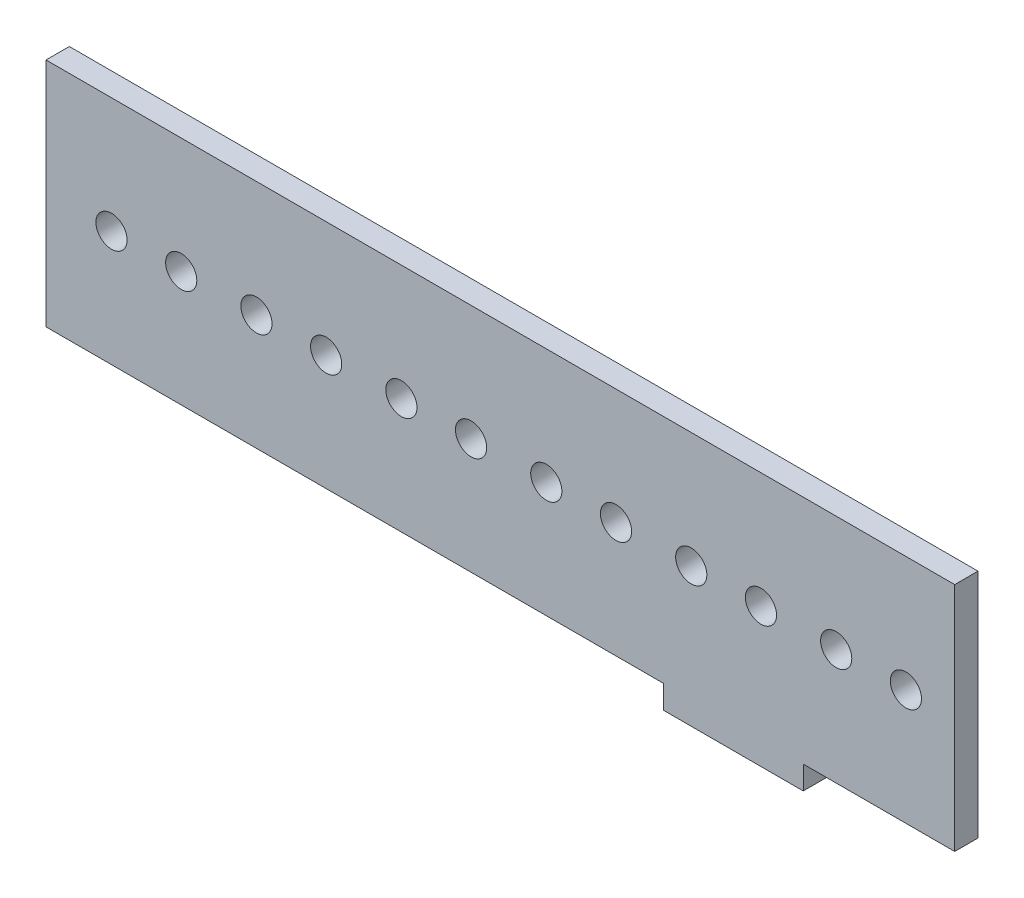
ISO-10303-21;
HEADER;
FILE_DESCRIPTION(('STEP AP214'),'2;1');
FILE_NAME('part.step','',(''),(''),'','','');
FILE_SCHEMA(('AUTOMOTIVE_DESIGN { 1 0 10303 214 1 1 1 1 }'));
ENDSEC;
DATA;
#1=APPLICATION_CONTEXT('core data for automotive mechanical design processes');
#2=APPLICATION_PROTOCOL_DEFINITION('international standard','automotive_design',2000,#1);
#3=PRODUCT_CONTEXT('',#1,'mechanical');
#4=PRODUCT('Part','Part','',(#3));
#5=PRODUCT_RELATED_PRODUCT_CATEGORY('part','',(#4));
#6=PRODUCT_DEFINITION_FORMATION('','',#4);
#7=PRODUCT_DEFINITION_CONTEXT('part definition',#1,'design');
#8=PRODUCT_DEFINITION('design','',#6,#7);
#9=PRODUCT_DEFINITION_SHAPE('','',#8);
#10=(LENGTH_UNIT() NAMED_UNIT(*) SI_UNIT(.MILLI.,.METRE.));
#11=(NAMED_UNIT(*) PLANE_ANGLE_UNIT() SI_UNIT($,.RADIAN.));
#12=(NAMED_UNIT(*) SI_UNIT($,.STERADIAN.) SOLID_ANGLE_UNIT());
#13=UNCERTAINTY_MEASURE_WITH_UNIT(LENGTH_MEASURE(1.E-05),#10,'distance_accuracy_value','');
#14=(GEOMETRIC_REPRESENTATION_CONTEXT(3) GLOBAL_UNCERTAINTY_ASSIGNED_CONTEXT((#13)) GLOBAL_UNIT_ASSIGNED_CONTEXT((#10,
#11,#12)) REPRESENTATION_CONTEXT('',''));
#15=CARTESIAN_POINT('',(0.,0.,0.));
#16=DIRECTION('',(0.,0.,1.));
#17=DIRECTION('',(1.,0.,0.));
#18=AXIS2_PLACEMENT_3D('',#15,#16,#17);
#19=CARTESIAN_POINT('',(0.,0.,6.35));
#20=DIRECTION('',(0.,0.,-1.));
#21=DIRECTION('',(-1.,0.,0.));
#22=AXIS2_PLACEMENT_3D('',#19,#20,#21);
#23=PLANE('',#22);
#24=DIRECTION('',(-1.,0.,0.));
#25=VECTOR('',#24,1.);
#26=CARTESIAN_POINT('',(-123.825,31.5,6.35));
#27=LINE('',#26,#25);
#28=CARTESIAN_POINT('',(123.825,31.5,6.35));
#29=VERTEX_POINT('',#28);
#30=CARTESIAN_POINT('',(-123.825,31.5,6.35));
#31=VERTEX_POINT('',#30);
#32=EDGE_CURVE('E164',#29,#31,#27,.T.);
#33=ORIENTED_EDGE('',*,*,#32,.T.);
#34=DIRECTION('',(0.,-1.,0.));
#35=VECTOR('',#34,1.);
#36=CARTESIAN_POINT('',(-123.825,-31.5,6.35));
#37=LINE('',#36,#35);
#38=CARTESIAN_POINT('',(-123.825,-31.5,6.35));
#39=VERTEX_POINT('',#38);
#40=EDGE_CURVE('E100',#31,#39,#37,.T.);
#41=ORIENTED_EDGE('',*,*,#40,.T.);
#42=DIRECTION('',(1.,0.,0.));
#43=VECTOR('',#42,1.);
#44=CARTESIAN_POINT('',(44.45,-31.5,6.35));
#45=LINE('',#44,#43);
#46=CARTESIAN_POINT('',(44.45,-31.5,6.35));
#47=VERTEX_POINT('',#46);
#48=EDGE_CURVE('E185',#39,#47,#45,.T.);
#49=ORIENTED_EDGE('',*,*,#48,.T.);
#50=DIRECTION('',(0.,-1.,0.));
#51=VECTOR('',#50,1.);
#52=CARTESIAN_POINT('',(44.45,-31.5,6.35));
#53=LINE('',#52,#51);
#54=CARTESIAN_POINT('',(44.45,-37.85,6.35));
#55=VERTEX_POINT('',#54);
#56=EDGE_CURVE('E199',#47,#55,#53,.T.);
#57=ORIENTED_EDGE('',*,*,#56,.T.);
#58=DIRECTION('',(1.,0.,0.));
#59=VECTOR('',#58,1.);
#60=CARTESIAN_POINT('',(44.45,-37.85,6.35));
#61=LINE('',#60,#59);
#62=CARTESIAN_POINT('',(82.55,-37.85,6.35));
#63=VERTEX_POINT('',#62);
#64=EDGE_CURVE('E119',#55,#63,#61,.T.);
#65=ORIENTED_EDGE('',*,*,#64,.T.);
#66=DIRECTION('',(0.,1.,0.));
#67=VECTOR('',#66,1.);
#68=CARTESIAN_POINT('',(82.55,-37.85,6.35));
#69=LINE('',#68,#67);
#70=CARTESIAN_POINT('',(82.55,-31.5,6.35));
#71=VERTEX_POINT('',#70);
#72=EDGE_CURVE('E113',#63,#71,#69,.T.);
#73=ORIENTED_EDGE('',*,*,#72,.T.);
#74=DIRECTION('',(1.,0.,0.));
#75=VECTOR('',#74,1.);
#76=CARTESIAN_POINT('',(123.825,-31.5,6.35));
#77=LINE('',#76,#75);
#78=CARTESIAN_POINT('',(123.825,-31.5,6.35));
#79=VERTEX_POINT('',#78);
#80=EDGE_CURVE('E117',#71,#79,#77,.T.);
#81=ORIENTED_EDGE('',*,*,#80,.T.);
#82=DIRECTION('',(0.,1.,0.));
#83=VECTOR('',#82,1.);
#84=CARTESIAN_POINT('',(123.825,31.5,6.35));
#85=LINE('',#84,#83);
#86=EDGE_CURVE('E57',#79,#29,#85,.T.);
#87=ORIENTED_EDGE('',*,*,#86,.T.);
#88=EDGE_LOOP('',(#33,#41,#49,#57,#65,#73,#81,#87));
#89=FACE_BOUND('',#88,.T.);
#90=CARTESIAN_POINT('',(-105.975,0.,6.35));
#91=DIRECTION('',(0.,0.,1.));
#92=DIRECTION('',(1.,0.,0.));
#93=AXIS2_PLACEMENT_3D('',#90,#91,#92);
#94=CIRCLE('',#93,4.24999999999998);
#95=CARTESIAN_POINT('',(-101.725,0.,6.35));
#96=VERTEX_POINT('',#95);
#97=EDGE_CURVE('E146',#96,#96,#94,.T.);
#98=ORIENTED_EDGE('',*,*,#97,.F.);
#99=EDGE_LOOP('',(#98));
#100=FACE_BOUND('',#99,.T.);
#101=CARTESIAN_POINT('',(-86.975,0.,6.35));
#102=DIRECTION('',(0.,0.,1.));
#103=DIRECTION('',(1.,0.,0.));
#104=AXIS2_PLACEMENT_3D('',#101,#102,#103);
#105=CIRCLE('',#104,4.25000000000003);
#106=CARTESIAN_POINT('',(-82.725,0.,6.35));
#107=VERTEX_POINT('',#106);
#108=EDGE_CURVE('E213',#107,#107,#105,.T.);
#109=ORIENTED_EDGE('',*,*,#108,.F.);
#110=EDGE_LOOP('',(#109));
#111=FACE_BOUND('',#110,.T.);
#112=CARTESIAN_POINT('',(-66.475,0.,6.35));
#113=DIRECTION('',(0.,0.,1.));
#114=DIRECTION('',(1.,0.,0.));
#115=AXIS2_PLACEMENT_3D('',#112,#113,#114);
#116=CIRCLE('',#115,4.24999999999998);
#117=CARTESIAN_POINT('',(-62.225,0.,6.35));
#118=VERTEX_POINT('',#117);
#119=EDGE_CURVE('E221',#118,#118,#116,.T.);
#120=ORIENTED_EDGE('',*,*,#119,.F.);
#121=EDGE_LOOP('',(#120));
#122=FACE_BOUND('',#121,.T.);
#123=CARTESIAN_POINT('',(-47.475,0.,6.35));
#124=DIRECTION('',(0.,0.,1.));
#125=DIRECTION('',(1.,0.,0.));
#126=AXIS2_PLACEMENT_3D('',#123,#124,#125);
#127=CIRCLE('',#126,4.25000000000001);
#128=CARTESIAN_POINT('',(-43.225,0.,6.35));
#129=VERTEX_POINT('',#128);
#130=EDGE_CURVE('E229',#129,#129,#127,.T.);
#131=ORIENTED_EDGE('',*,*,#130,.F.);
#132=EDGE_LOOP('',(#131));
#133=FACE_BOUND('',#132,.T.);
#134=CARTESIAN_POINT('',(-26.975,0.,6.35));
#135=DIRECTION('',(0.,0.,1.));
#136=DIRECTION('',(1.,0.,0.));
#137=AXIS2_PLACEMENT_3D('',#134,#135,#136);
#138=CIRCLE('',#137,4.25);
#139=CARTESIAN_POINT('',(-22.725,0.,6.35));
#140=VERTEX_POINT('',#139);
#141=EDGE_CURVE('E237',#140,#140,#138,.T.);
#142=ORIENTED_EDGE('',*,*,#141,.F.);
#143=EDGE_LOOP('',(#142));
#144=FACE_BOUND('',#143,.T.);
#145=CARTESIAN_POINT('',(-7.975,0.,6.35));
#146=DIRECTION('',(0.,0.,1.));
#147=DIRECTION('',(1.,0.,0.));
#148=AXIS2_PLACEMENT_3D('',#145,#146,#147);
#149=CIRCLE('',#148,4.25000000000001);
#150=CARTESIAN_POINT('',(-3.72499999999999,0.,6.35));
#151=VERTEX_POINT('',#150);
#152=EDGE_CURVE('E245',#151,#151,#149,.T.);
#153=ORIENTED_EDGE('',*,*,#152,.F.);
#154=EDGE_LOOP('',(#153));
#155=FACE_BOUND('',#154,.T.);
#156=CARTESIAN_POINT('',(12.525,0.,6.35));
#157=DIRECTION('',(0.,0.,1.));
#158=DIRECTION('',(1.,0.,0.));
#159=AXIS2_PLACEMENT_3D('',#156,#157,#158);
#160=CIRCLE('',#159,4.25000000000001);
#161=CARTESIAN_POINT('',(16.775,0.,6.35));
#162=VERTEX_POINT('',#161);
#163=EDGE_CURVE('E253',#162,#162,#160,.T.);
#164=ORIENTED_EDGE('',*,*,#163,.F.);
#165=EDGE_LOOP('',(#164));
#166=FACE_BOUND('',#165,.T.);
#167=CARTESIAN_POINT('',(31.525,0.,6.35));
#168=DIRECTION('',(0.,0.,1.));
#169=DIRECTION('',(1.,0.,0.));
#170=AXIS2_PLACEMENT_3D('',#167,#168,#169);
#171=CIRCLE('',#170,4.25000000000001);
#172=CARTESIAN_POINT('',(35.775,0.,6.35));
#173=VERTEX_POINT('',#172);
#174=EDGE_CURVE('E261',#173,#173,#171,.T.);
#175=ORIENTED_EDGE('',*,*,#174,.F.);
#176=EDGE_LOOP('',(#175));
#177=FACE_BOUND('',#176,.T.);
#178=CARTESIAN_POINT('',(52.025,0.,6.35));
#179=DIRECTION('',(0.,0.,1.));
#180=DIRECTION('',(1.,0.,0.));
#181=AXIS2_PLACEMENT_3D('',#178,#179,#180);
#182=CIRCLE('',#181,4.25000000000001);
#183=CARTESIAN_POINT('',(56.275,0.,6.35));
#184=VERTEX_POINT('',#183);
#185=EDGE_CURVE('E269',#184,#184,#182,.T.);
#186=ORIENTED_EDGE('',*,*,#185,.F.);
#187=EDGE_LOOP('',(#186));
#188=FACE_BOUND('',#187,.T.);
#189=CARTESIAN_POINT('',(71.025,0.,6.35));
#190=DIRECTION('',(0.,0.,1.));
#191=DIRECTION('',(1.,0.,0.));
#192=AXIS2_PLACEMENT_3D('',#189,#190,#191);
#193=CIRCLE('',#192,4.25000000000003);
#194=CARTESIAN_POINT('',(75.275,0.,6.35));
#195=VERTEX_POINT('',#194);
#196=EDGE_CURVE('E277',#195,#195,#193,.T.);
#197=ORIENTED_EDGE('',*,*,#196,.F.);
#198=EDGE_LOOP('',(#197));
#199=FACE_BOUND('',#198,.T.);
#200=CARTESIAN_POINT('',(91.525,0.,6.35));
#201=DIRECTION('',(0.,0.,1.));
#202=DIRECTION('',(1.,0.,0.));
#203=AXIS2_PLACEMENT_3D('',#200,#201,#202);
#204=CIRCLE('',#203,4.25000000000003);
#205=CARTESIAN_POINT('',(95.775,0.,6.35));
#206=VERTEX_POINT('',#205);
#207=EDGE_CURVE('E285',#206,#206,#204,.T.);
#208=ORIENTED_EDGE('',*,*,#207,.F.);
#209=EDGE_LOOP('',(#208));
#210=FACE_BOUND('',#209,.T.);
#211=CARTESIAN_POINT('',(110.525,0.,6.35));
#212=DIRECTION('',(0.,0.,1.));
#213=DIRECTION('',(1.,0.,0.));
#214=AXIS2_PLACEMENT_3D('',#211,#212,#213);
#215=CIRCLE('',#214,4.25000000000003);
#216=CARTESIAN_POINT('',(114.775,0.,6.35));
#217=VERTEX_POINT('',#216);
#218=EDGE_CURVE('E293',#217,#217,#215,.T.);
#219=ORIENTED_EDGE('',*,*,#218,.F.);
#220=EDGE_LOOP('',(#219));
#221=FACE_BOUND('',#220,.T.);
#222=ADVANCED_FACE('F39',(#89,#100,#111,#122,#133,#144,#155,#166,#177,#188,#199,#210,#221),#23,.F.);
#223=CARTESIAN_POINT('',(0.,0.,0.));
#224=DIRECTION('',(0.,0.,-1.));
#225=DIRECTION('',(-1.,0.,0.));
#226=AXIS2_PLACEMENT_3D('',#223,#224,#225);
#227=PLANE('',#226);
#228=CARTESIAN_POINT('',(91.525,0.,0.));
#229=DIRECTION('',(0.,0.,1.));
#230=DIRECTION('',(1.,0.,0.));
#231=AXIS2_PLACEMENT_3D('',#228,#229,#230);
#232=CIRCLE('',#231,4.25000000000003);
#233=CARTESIAN_POINT('',(95.775,0.,0.));
#234=VERTEX_POINT('',#233);
#235=EDGE_CURVE('E289',#234,#234,#232,.T.);
#236=ORIENTED_EDGE('',*,*,#235,.T.);
#237=EDGE_LOOP('',(#236));
#238=FACE_BOUND('',#237,.T.);
#239=CARTESIAN_POINT('',(52.025,0.,0.));
#240=DIRECTION('',(0.,0.,1.));
#241=DIRECTION('',(1.,0.,0.));
#242=AXIS2_PLACEMENT_3D('',#239,#240,#241);
#243=CIRCLE('',#242,4.25000000000001);
#244=CARTESIAN_POINT('',(56.275,0.,0.));
#245=VERTEX_POINT('',#244);
#246=EDGE_CURVE('E273',#245,#245,#243,.T.);
#247=ORIENTED_EDGE('',*,*,#246,.T.);
#248=EDGE_LOOP('',(#247));
#249=FACE_BOUND('',#248,.T.);
#250=CARTESIAN_POINT('',(12.525,0.,0.));
#251=DIRECTION('',(0.,0.,1.));
#252=DIRECTION('',(1.,0.,0.));
#253=AXIS2_PLACEMENT_3D('',#250,#251,#252);
#254=CIRCLE('',#253,4.25000000000001);
#255=CARTESIAN_POINT('',(16.775,0.,0.));
#256=VERTEX_POINT('',#255);
#257=EDGE_CURVE('E257',#256,#256,#254,.T.);
#258=ORIENTED_EDGE('',*,*,#257,.T.);
#259=EDGE_LOOP('',(#258));
#260=FACE_BOUND('',#259,.T.);
#261=CARTESIAN_POINT('',(-26.975,0.,0.));
#262=DIRECTION('',(0.,0.,1.));
#263=DIRECTION('',(1.,0.,0.));
#264=AXIS2_PLACEMENT_3D('',#261,#262,#263);
#265=CIRCLE('',#264,4.25);
#266=CARTESIAN_POINT('',(-22.725,0.,0.));
#267=VERTEX_POINT('',#266);
#268=EDGE_CURVE('E241',#267,#267,#265,.T.);
#269=ORIENTED_EDGE('',*,*,#268,.T.);
#270=EDGE_LOOP('',(#269));
#271=FACE_BOUND('',#270,.T.);
#272=CARTESIAN_POINT('',(-66.475,0.,0.));
#273=DIRECTION('',(0.,0.,1.));
#274=DIRECTION('',(1.,0.,0.));
#275=AXIS2_PLACEMENT_3D('',#272,#273,#274);
#276=CIRCLE('',#275,4.24999999999998);
#277=CARTESIAN_POINT('',(-62.225,0.,0.));
#278=VERTEX_POINT('',#277);
#279=EDGE_CURVE('E225',#278,#278,#276,.T.);
#280=ORIENTED_EDGE('',*,*,#279,.T.);
#281=EDGE_LOOP('',(#280));
#282=FACE_BOUND('',#281,.T.);
#283=CARTESIAN_POINT('',(-105.975,0.,0.));
#284=DIRECTION('',(0.,0.,1.));
#285=DIRECTION('',(1.,0.,0.));
#286=AXIS2_PLACEMENT_3D('',#283,#284,#285);
#287=CIRCLE('',#286,4.24999999999998);
#288=CARTESIAN_POINT('',(-101.725,0.,0.));
#289=VERTEX_POINT('',#288);
#290=EDGE_CURVE('E209',#289,#289,#287,.T.);
#291=ORIENTED_EDGE('',*,*,#290,.T.);
#292=EDGE_LOOP('',(#291));
#293=FACE_BOUND('',#292,.T.);
#294=DIRECTION('',(-1.,0.,0.));
#295=VECTOR('',#294,1.);
#296=CARTESIAN_POINT('',(-123.825,31.5,0.));
#297=LINE('',#296,#295);
#298=CARTESIAN_POINT('',(123.825,31.5,0.));
#299=VERTEX_POINT('',#298);
#300=CARTESIAN_POINT('',(-123.825,31.5,0.));
#301=VERTEX_POINT('',#300);
#302=EDGE_CURVE('E141',#299,#301,#297,.T.);
#303=ORIENTED_EDGE('',*,*,#302,.F.);
#304=DIRECTION('',(0.,1.,0.));
#305=VECTOR('',#304,1.);
#306=CARTESIAN_POINT('',(123.825,31.5,0.));
#307=LINE('',#306,#305);
#308=CARTESIAN_POINT('',(123.825,-31.5,0.));
#309=VERTEX_POINT('',#308);
#310=EDGE_CURVE('E92',#309,#299,#307,.T.);
#311=ORIENTED_EDGE('',*,*,#310,.F.);
#312=DIRECTION('',(1.,0.,0.));
#313=VECTOR('',#312,1.);
#314=CARTESIAN_POINT('',(123.825,-31.5,0.));
#315=LINE('',#314,#313);
#316=CARTESIAN_POINT('',(82.55,-31.5,0.));
#317=VERTEX_POINT('',#316);
#318=EDGE_CURVE('E86',#317,#309,#315,.T.);
#319=ORIENTED_EDGE('',*,*,#318,.F.);
#320=DIRECTION('',(0.,1.,0.));
#321=VECTOR('',#320,1.);
#322=CARTESIAN_POINT('',(82.55,-37.85,0.));
#323=LINE('',#322,#321);
#324=CARTESIAN_POINT('',(82.55,-37.85,0.));
#325=VERTEX_POINT('',#324);
#326=EDGE_CURVE('E128',#325,#317,#323,.T.);
#327=ORIENTED_EDGE('',*,*,#326,.F.);
#328=DIRECTION('',(1.,0.,0.));
#329=VECTOR('',#328,1.);
#330=CARTESIAN_POINT('',(44.45,-37.85,0.));
#331=LINE('',#330,#329);
#332=CARTESIAN_POINT('',(44.45,-37.85,0.));
#333=VERTEX_POINT('',#332);
#334=EDGE_CURVE('E155',#333,#325,#331,.T.);
#335=ORIENTED_EDGE('',*,*,#334,.F.);
#336=DIRECTION('',(0.,-1.,0.));
#337=VECTOR('',#336,1.);
#338=CARTESIAN_POINT('',(44.45,-31.5,0.));
#339=LINE('',#338,#337);
#340=CARTESIAN_POINT('',(44.45,-31.5,0.));
#341=VERTEX_POINT('',#340);
#342=EDGE_CURVE('E152',#341,#333,#339,.T.);
#343=ORIENTED_EDGE('',*,*,#342,.F.);
#344=DIRECTION('',(1.,0.,0.));
#345=VECTOR('',#344,1.);
#346=CARTESIAN_POINT('',(44.45,-31.5,0.));
#347=LINE('',#346,#345);
#348=CARTESIAN_POINT('',(-123.825,-31.5,0.));
#349=VERTEX_POINT('',#348);
#350=EDGE_CURVE('E149',#349,#341,#347,.T.);
#351=ORIENTED_EDGE('',*,*,#350,.F.);
#352=DIRECTION('',(0.,-1.,0.));
#353=VECTOR('',#352,1.);
#354=CARTESIAN_POINT('',(-123.825,-31.5,0.));
#355=LINE('',#354,#353);
#356=EDGE_CURVE('E145',#301,#349,#355,.T.);
#357=ORIENTED_EDGE('',*,*,#356,.F.);
#358=EDGE_LOOP('',(#303,#311,#319,#327,#335,#343,#351,#357));
#359=FACE_BOUND('',#358,.T.);
#360=CARTESIAN_POINT('',(-86.975,0.,0.));
#361=DIRECTION('',(0.,0.,1.));
#362=DIRECTION('',(1.,0.,0.));
#363=AXIS2_PLACEMENT_3D('',#360,#361,#362);
#364=CIRCLE('',#363,4.25000000000003);
#365=CARTESIAN_POINT('',(-82.725,0.,0.));
#366=VERTEX_POINT('',#365);
#367=EDGE_CURVE('E217',#366,#366,#364,.T.);
#368=ORIENTED_EDGE('',*,*,#367,.T.);
#369=EDGE_LOOP('',(#368));
#370=FACE_BOUND('',#369,.T.);
#371=CARTESIAN_POINT('',(-47.475,0.,0.));
#372=DIRECTION('',(0.,0.,1.));
#373=DIRECTION('',(1.,0.,0.));
#374=AXIS2_PLACEMENT_3D('',#371,#372,#373);
#375=CIRCLE('',#374,4.25000000000001);
#376=CARTESIAN_POINT('',(-43.225,0.,0.));
#377=VERTEX_POINT('',#376);
#378=EDGE_CURVE('E233',#377,#377,#375,.T.);
#379=ORIENTED_EDGE('',*,*,#378,.T.);
#380=EDGE_LOOP('',(#379));
#381=FACE_BOUND('',#380,.T.);
#382=CARTESIAN_POINT('',(-7.975,0.,0.));
#383=DIRECTION('',(0.,0.,1.));
#384=DIRECTION('',(1.,0.,0.));
#385=AXIS2_PLACEMENT_3D('',#382,#383,#384);
#386=CIRCLE('',#385,4.25000000000001);
#387=CARTESIAN_POINT('',(-3.72499999999999,0.,0.));
#388=VERTEX_POINT('',#387);
#389=EDGE_CURVE('E249',#388,#388,#386,.T.);
#390=ORIENTED_EDGE('',*,*,#389,.T.);
#391=EDGE_LOOP('',(#390));
#392=FACE_BOUND('',#391,.T.);
#393=CARTESIAN_POINT('',(31.525,0.,0.));
#394=DIRECTION('',(0.,0.,1.));
#395=DIRECTION('',(1.,0.,0.));
#396=AXIS2_PLACEMENT_3D('',#393,#394,#395);
#397=CIRCLE('',#396,4.25000000000001);
#398=CARTESIAN_POINT('',(35.775,0.,0.));
#399=VERTEX_POINT('',#398);
#400=EDGE_CURVE('E265',#399,#399,#397,.T.);
#401=ORIENTED_EDGE('',*,*,#400,.T.);
#402=EDGE_LOOP('',(#401));
#403=FACE_BOUND('',#402,.T.);
#404=CARTESIAN_POINT('',(71.025,0.,0.));
#405=DIRECTION('',(0.,0.,1.));
#406=DIRECTION('',(1.,0.,0.));
#407=AXIS2_PLACEMENT_3D('',#404,#405,#406);
#408=CIRCLE('',#407,4.25000000000003);
#409=CARTESIAN_POINT('',(75.275,0.,0.));
#410=VERTEX_POINT('',#409);
#411=EDGE_CURVE('E281',#410,#410,#408,.T.);
#412=ORIENTED_EDGE('',*,*,#411,.T.);
#413=EDGE_LOOP('',(#412));
#414=FACE_BOUND('',#413,.T.);
#415=CARTESIAN_POINT('',(110.525,0.,0.));
#416=DIRECTION('',(0.,0.,1.));
#417=DIRECTION('',(1.,0.,0.));
#418=AXIS2_PLACEMENT_3D('',#415,#416,#417);
#419=CIRCLE('',#418,4.25000000000003);
#420=CARTESIAN_POINT('',(114.775,0.,0.));
#421=VERTEX_POINT('',#420);
#422=EDGE_CURVE('E297',#421,#421,#419,.T.);
#423=ORIENTED_EDGE('',*,*,#422,.T.);
#424=EDGE_LOOP('',(#423));
#425=FACE_BOUND('',#424,.T.);
#426=ADVANCED_FACE('F189',(#238,#249,#260,#271,#282,#293,#359,#370,#381,#392,#403,#414,#425),
#227,.T.);
#427=CARTESIAN_POINT('',(-123.825,31.5,6.35));
#428=DIRECTION('',(0.,-1.,0.));
#429=DIRECTION('',(0.,0.,-1.));
#430=AXIS2_PLACEMENT_3D('',#427,#428,#429);
#431=PLANE('',#430);
#432=ORIENTED_EDGE('',*,*,#302,.T.);
#433=DIRECTION('',(0.,0.,-1.));
#434=VECTOR('',#433,1.);
#435=CARTESIAN_POINT('',(-123.825,31.5,6.35));
#436=LINE('',#435,#434);
#437=EDGE_CURVE('E11',#31,#301,#436,.T.);
#438=ORIENTED_EDGE('',*,*,#437,.F.);
#439=ORIENTED_EDGE('',*,*,#32,.F.);
#440=DIRECTION('',(0.,0.,-1.));
#441=VECTOR('',#440,1.);
#442=CARTESIAN_POINT('',(123.825,31.5,6.35));
#443=LINE('',#442,#441);
#444=EDGE_CURVE('E137',#29,#299,#443,.T.);
#445=ORIENTED_EDGE('',*,*,#444,.T.);
#446=EDGE_LOOP('',(#432,#438,#439,#445));
#447=FACE_BOUND('',#446,.T.);
#448=ADVANCED_FACE('F41',(#447),#431,.F.);
#449=CARTESIAN_POINT('',(-123.825,-31.5,6.35));
#450=DIRECTION('',(1.,0.,0.));
#451=DIRECTION('',(0.,0.,-1.));
#452=AXIS2_PLACEMENT_3D('',#449,#450,#451);
#453=PLANE('',#452);
#454=ORIENTED_EDGE('',*,*,#356,.T.);
#455=DIRECTION('',(0.,0.,-1.));
#456=VECTOR('',#455,1.);
#457=CARTESIAN_POINT('',(-123.825,-31.5,6.35));
#458=LINE('',#457,#456);
#459=EDGE_CURVE('E49',#39,#349,#458,.T.);
#460=ORIENTED_EDGE('',*,*,#459,.F.);
#461=ORIENTED_EDGE('',*,*,#40,.F.);
#462=ORIENTED_EDGE('',*,*,#437,.T.);
#463=EDGE_LOOP('',(#454,#460,#461,#462));
#464=FACE_BOUND('',#463,.T.);
#465=ADVANCED_FACE('F331',(#464),#453,.F.);
#466=CARTESIAN_POINT('',(44.45,-31.5,6.35));
#467=DIRECTION('',(0.,1.,0.));
#468=DIRECTION('',(0.,0.,1.));
#469=AXIS2_PLACEMENT_3D('',#466,#467,#468);
#470=PLANE('',#469);
#471=ORIENTED_EDGE('',*,*,#350,.T.);
#472=DIRECTION('',(0.,0.,-1.));
#473=VECTOR('',#472,1.);
#474=CARTESIAN_POINT('',(44.45,-31.5,6.35));
#475=LINE('',#474,#473);
#476=EDGE_CURVE('E175',#47,#341,#475,.T.);
#477=ORIENTED_EDGE('',*,*,#476,.F.);
#478=ORIENTED_EDGE('',*,*,#48,.F.);
#479=ORIENTED_EDGE('',*,*,#459,.T.);
#480=EDGE_LOOP('',(#471,#477,#478,#479));
#481=FACE_BOUND('',#480,.T.);
#482=ADVANCED_FACE('F183',(#481),#470,.F.);
#483=CARTESIAN_POINT('',(44.45,-31.5,6.35));
#484=DIRECTION('',(1.,0.,0.));
#485=DIRECTION('',(0.,0.,-1.));
#486=AXIS2_PLACEMENT_3D('',#483,#484,#485);
#487=PLANE('',#486);
#488=ORIENTED_EDGE('',*,*,#342,.T.);
#489=DIRECTION('',(0.,0.,-1.));
#490=VECTOR('',#489,1.);
#491=CARTESIAN_POINT('',(44.45,-37.85,6.35));
#492=LINE('',#491,#490);
#493=EDGE_CURVE('E171',#55,#333,#492,.T.);
#494=ORIENTED_EDGE('',*,*,#493,.F.);
#495=ORIENTED_EDGE('',*,*,#56,.F.);
#496=ORIENTED_EDGE('',*,*,#476,.T.);
#497=EDGE_LOOP('',(#488,#494,#495,#496));
#498=FACE_BOUND('',#497,.T.);
#499=ADVANCED_FACE('F194',(#498),#487,.F.);
#500=CARTESIAN_POINT('',(44.45,-37.85,6.35));
#501=DIRECTION('',(0.,1.,0.));
#502=DIRECTION('',(0.,0.,1.));
#503=AXIS2_PLACEMENT_3D('',#500,#501,#502);
#504=PLANE('',#503);
#505=ORIENTED_EDGE('',*,*,#334,.T.);
#506=DIRECTION('',(0.,0.,-1.));
#507=VECTOR('',#506,1.);
#508=CARTESIAN_POINT('',(82.55,-37.85,6.35));
#509=LINE('',#508,#507);
#510=EDGE_CURVE('E130',#63,#325,#509,.T.);
#511=ORIENTED_EDGE('',*,*,#510,.F.);
#512=ORIENTED_EDGE('',*,*,#64,.F.);
#513=ORIENTED_EDGE('',*,*,#493,.T.);
#514=EDGE_LOOP('',(#505,#511,#512,#513));
#515=FACE_BOUND('',#514,.T.);
#516=ADVANCED_FACE('F197',(#515),#504,.F.);
#517=CARTESIAN_POINT('',(82.55,-37.85,6.35));
#518=DIRECTION('',(-1.,0.,0.));
#519=DIRECTION('',(0.,0.,1.));
#520=AXIS2_PLACEMENT_3D('',#517,#518,#519);
#521=PLANE('',#520);
#522=ORIENTED_EDGE('',*,*,#326,.T.);
#523=DIRECTION('',(0.,0.,-1.));
#524=VECTOR('',#523,1.);
#525=CARTESIAN_POINT('',(82.55,-31.5,6.35));
#526=LINE('',#525,#524);
#527=EDGE_CURVE('E125',#71,#317,#526,.T.);
#528=ORIENTED_EDGE('',*,*,#527,.F.);
#529=ORIENTED_EDGE('',*,*,#72,.F.);
#530=ORIENTED_EDGE('',*,*,#510,.T.);
#531=EDGE_LOOP('',(#522,#528,#529,#530));
#532=FACE_BOUND('',#531,.T.);
#533=ADVANCED_FACE('F126',(#532),#521,.F.);
#534=CARTESIAN_POINT('',(123.825,-31.5,6.35));
#535=DIRECTION('',(0.,1.,0.));
#536=DIRECTION('',(0.,0.,1.));
#537=AXIS2_PLACEMENT_3D('',#534,#535,#536);
#538=PLANE('',#537);
#539=ORIENTED_EDGE('',*,*,#318,.T.);
#540=DIRECTION('',(0.,0.,-1.));
#541=VECTOR('',#540,1.);
#542=CARTESIAN_POINT('',(123.825,-31.5,6.35));
#543=LINE('',#542,#541);
#544=EDGE_CURVE('E131',#79,#309,#543,.T.);
#545=ORIENTED_EDGE('',*,*,#544,.F.);
#546=ORIENTED_EDGE('',*,*,#80,.F.);
#547=ORIENTED_EDGE('',*,*,#527,.T.);
#548=EDGE_LOOP('',(#539,#545,#546,#547));
#549=FACE_BOUND('',#548,.T.);
#550=ADVANCED_FACE('F133',(#549),#538,.F.);
#551=CARTESIAN_POINT('',(123.825,31.5,6.35));
#552=DIRECTION('',(-1.,0.,0.));
#553=DIRECTION('',(0.,0.,1.));
#554=AXIS2_PLACEMENT_3D('',#551,#552,#553);
#555=PLANE('',#554);
#556=ORIENTED_EDGE('',*,*,#310,.T.);
#557=ORIENTED_EDGE('',*,*,#444,.F.);
#558=ORIENTED_EDGE('',*,*,#86,.F.);
#559=ORIENTED_EDGE('',*,*,#544,.T.);
#560=EDGE_LOOP('',(#556,#557,#558,#559));
#561=FACE_BOUND('',#560,.T.);
#562=ADVANCED_FACE('F319',(#561),#555,.F.);
#563=CARTESIAN_POINT('',(-105.975,0.,6.35));
#564=DIRECTION('',(0.,0.,-1.));
#565=DIRECTION('',(-1.,0.,0.));
#566=AXIS2_PLACEMENT_3D('',#563,#564,#565);
#567=CYLINDRICAL_SURFACE('',#566,4.24999999999998);
#568=ORIENTED_EDGE('',*,*,#97,.T.);
#569=EDGE_LOOP('',(#568));
#570=FACE_BOUND('',#569,.T.);
#571=ORIENTED_EDGE('',*,*,#290,.F.);
#572=EDGE_LOOP('',(#571));
#573=FACE_BOUND('',#572,.T.);
#574=ADVANCED_FACE('F316',(#570,#573),#567,.F.);
#575=CARTESIAN_POINT('',(-86.975,0.,6.35));
#576=DIRECTION('',(0.,0.,-1.));
#577=DIRECTION('',(-1.,0.,0.));
#578=AXIS2_PLACEMENT_3D('',#575,#576,#577);
#579=CYLINDRICAL_SURFACE('',#578,4.25000000000003);
#580=ORIENTED_EDGE('',*,*,#108,.T.);
#581=EDGE_LOOP('',(#580));
#582=FACE_BOUND('',#581,.T.);
#583=ORIENTED_EDGE('',*,*,#367,.F.);
#584=EDGE_LOOP('',(#583));
#585=FACE_BOUND('',#584,.T.);
#586=ADVANCED_FACE('F395',(#582,#585),#579,.F.);
#587=CARTESIAN_POINT('',(-66.475,0.,6.35));
#588=DIRECTION('',(0.,0.,-1.));
#589=DIRECTION('',(-1.,0.,0.));
#590=AXIS2_PLACEMENT_3D('',#587,#588,#589);
#591=CYLINDRICAL_SURFACE('',#590,4.24999999999998);
#592=ORIENTED_EDGE('',*,*,#119,.T.);
#593=EDGE_LOOP('',(#592));
#594=FACE_BOUND('',#593,.T.);
#595=ORIENTED_EDGE('',*,*,#279,.F.);
#596=EDGE_LOOP('',(#595));
#597=FACE_BOUND('',#596,.T.);
#598=ADVANCED_FACE('F403',(#594,#597),#591,.F.);
#599=CARTESIAN_POINT('',(-47.475,0.,6.35));
#600=DIRECTION('',(0.,0.,-1.));
#601=DIRECTION('',(-1.,0.,0.));
#602=AXIS2_PLACEMENT_3D('',#599,#600,#601);
#603=CYLINDRICAL_SURFACE('',#602,4.25000000000001);
#604=ORIENTED_EDGE('',*,*,#130,.T.);
#605=EDGE_LOOP('',(#604));
#606=FACE_BOUND('',#605,.T.);
#607=ORIENTED_EDGE('',*,*,#378,.F.);
#608=EDGE_LOOP('',(#607));
#609=FACE_BOUND('',#608,.T.);
#610=ADVANCED_FACE('F411',(#606,#609),#603,.F.);
#611=CARTESIAN_POINT('',(-26.975,0.,6.35));
#612=DIRECTION('',(0.,0.,-1.));
#613=DIRECTION('',(-1.,0.,0.));
#614=AXIS2_PLACEMENT_3D('',#611,#612,#613);
#615=CYLINDRICAL_SURFACE('',#614,4.25);
#616=ORIENTED_EDGE('',*,*,#141,.T.);
#617=EDGE_LOOP('',(#616));
#618=FACE_BOUND('',#617,.T.);
#619=ORIENTED_EDGE('',*,*,#268,.F.);
#620=EDGE_LOOP('',(#619));
#621=FACE_BOUND('',#620,.T.);
#622=ADVANCED_FACE('F420',(#618,#621),#615,.F.);
#623=CARTESIAN_POINT('',(-7.975,0.,6.35));
#624=DIRECTION('',(0.,0.,-1.));
#625=DIRECTION('',(-1.,0.,0.));
#626=AXIS2_PLACEMENT_3D('',#623,#624,#625);
#627=CYLINDRICAL_SURFACE('',#626,4.25000000000001);
#628=ORIENTED_EDGE('',*,*,#152,.T.);
#629=EDGE_LOOP('',(#628));
#630=FACE_BOUND('',#629,.T.);
#631=ORIENTED_EDGE('',*,*,#389,.F.);
#632=EDGE_LOOP('',(#631));
#633=FACE_BOUND('',#632,.T.);
#634=ADVANCED_FACE('F429',(#630,#633),#627,.F.);
#635=CARTESIAN_POINT('',(12.525,0.,6.35));
#636=DIRECTION('',(0.,0.,-1.));
#637=DIRECTION('',(-1.,0.,0.));
#638=AXIS2_PLACEMENT_3D('',#635,#636,#637);
#639=CYLINDRICAL_SURFACE('',#638,4.25000000000001);
#640=ORIENTED_EDGE('',*,*,#163,.T.);
#641=EDGE_LOOP('',(#640));
#642=FACE_BOUND('',#641,.T.);
#643=ORIENTED_EDGE('',*,*,#257,.F.);
#644=EDGE_LOOP('',(#643));
#645=FACE_BOUND('',#644,.T.);
#646=ADVANCED_FACE('F438',(#642,#645),#639,.F.);
#647=CARTESIAN_POINT('',(31.525,0.,6.35));
#648=DIRECTION('',(0.,0.,-1.));
#649=DIRECTION('',(-1.,0.,0.));
#650=AXIS2_PLACEMENT_3D('',#647,#648,#649);
#651=CYLINDRICAL_SURFACE('',#650,4.25000000000001);
#652=ORIENTED_EDGE('',*,*,#174,.T.);
#653=EDGE_LOOP('',(#652));
#654=FACE_BOUND('',#653,.T.);
#655=ORIENTED_EDGE('',*,*,#400,.F.);
#656=EDGE_LOOP('',(#655));
#657=FACE_BOUND('',#656,.T.);
#658=ADVANCED_FACE('F447',(#654,#657),#651,.F.);
#659=CARTESIAN_POINT('',(52.025,0.,6.35));
#660=DIRECTION('',(0.,0.,-1.));
#661=DIRECTION('',(-1.,0.,0.));
#662=AXIS2_PLACEMENT_3D('',#659,#660,#661);
#663=CYLINDRICAL_SURFACE('',#662,4.25000000000001);
#664=ORIENTED_EDGE('',*,*,#185,.T.);
#665=EDGE_LOOP('',(#664));
#666=FACE_BOUND('',#665,.T.);
#667=ORIENTED_EDGE('',*,*,#246,.F.);
#668=EDGE_LOOP('',(#667));
#669=FACE_BOUND('',#668,.T.);
#670=ADVANCED_FACE('F456',(#666,#669),#663,.F.);
#671=CARTESIAN_POINT('',(71.025,0.,6.35));
#672=DIRECTION('',(0.,0.,-1.));
#673=DIRECTION('',(-1.,0.,0.));
#674=AXIS2_PLACEMENT_3D('',#671,#672,#673);
#675=CYLINDRICAL_SURFACE('',#674,4.25000000000003);
#676=ORIENTED_EDGE('',*,*,#196,.T.);
#677=EDGE_LOOP('',(#676));
#678=FACE_BOUND('',#677,.T.);
#679=ORIENTED_EDGE('',*,*,#411,.F.);
#680=EDGE_LOOP('',(#679));
#681=FACE_BOUND('',#680,.T.);
#682=ADVANCED_FACE('F465',(#678,#681),#675,.F.);
#683=CARTESIAN_POINT('',(91.525,0.,6.35));
#684=DIRECTION('',(0.,0.,-1.));
#685=DIRECTION('',(-1.,0.,0.));
#686=AXIS2_PLACEMENT_3D('',#683,#684,#685);
#687=CYLINDRICAL_SURFACE('',#686,4.25000000000003);
#688=ORIENTED_EDGE('',*,*,#207,.T.);
#689=EDGE_LOOP('',(#688));
#690=FACE_BOUND('',#689,.T.);
#691=ORIENTED_EDGE('',*,*,#235,.F.);
#692=EDGE_LOOP('',(#691));
#693=FACE_BOUND('',#692,.T.);
#694=ADVANCED_FACE('F474',(#690,#693),#687,.F.);
#695=CARTESIAN_POINT('',(110.525,0.,6.35));
#696=DIRECTION('',(0.,0.,-1.));
#697=DIRECTION('',(-1.,0.,0.));
#698=AXIS2_PLACEMENT_3D('',#695,#696,#697);
#699=CYLINDRICAL_SURFACE('',#698,4.25000000000003);
#700=ORIENTED_EDGE('',*,*,#218,.T.);
#701=EDGE_LOOP('',(#700));
#702=FACE_BOUND('',#701,.T.);
#703=ORIENTED_EDGE('',*,*,#422,.F.);
#704=EDGE_LOOP('',(#703));
#705=FACE_BOUND('',#704,.T.);
#706=ADVANCED_FACE('F305',(#702,#705),#699,.F.);
#707=CLOSED_SHELL('',(#222,#426,#448,#465,#482,#499,#516,#533,#550,#562,#574,#586,#598,#610,
#622,#634,#646,#658,#670,#682,#694,#706));
#708=MANIFOLD_SOLID_BREP('B2',#707);
#709=ADVANCED_BREP_SHAPE_REPRESENTATION('',(#18,#708),#14);
#710=SHAPE_DEFINITION_REPRESENTATION(#9,#709);
ENDSEC;
END-ISO-10303-21;
